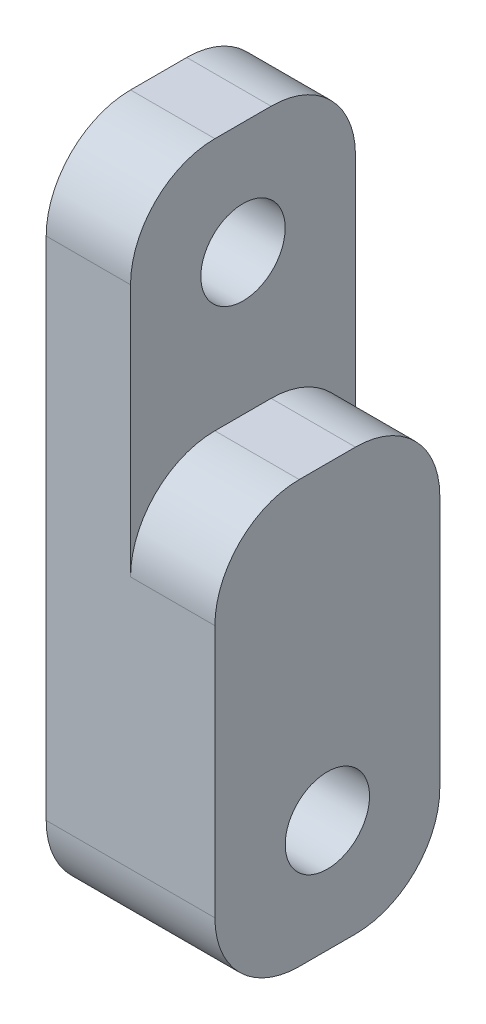
ISO-10303-21;
HEADER;
FILE_DESCRIPTION(('STEP AP214'),'2;1');
FILE_NAME('part.step','',(''),(''),'','','');
FILE_SCHEMA(('AUTOMOTIVE_DESIGN { 1 0 10303 214 1 1 1 1 }'));
ENDSEC;
DATA;
#1=APPLICATION_CONTEXT('core data for automotive mechanical design processes');
#2=APPLICATION_PROTOCOL_DEFINITION('international standard','automotive_design',2000,#1);
#3=PRODUCT_CONTEXT('',#1,'mechanical');
#4=PRODUCT('Part','Part','',(#3));
#5=PRODUCT_RELATED_PRODUCT_CATEGORY('part','',(#4));
#6=PRODUCT_DEFINITION_FORMATION('','',#4);
#7=PRODUCT_DEFINITION_CONTEXT('part definition',#1,'design');
#8=PRODUCT_DEFINITION('design','',#6,#7);
#9=PRODUCT_DEFINITION_SHAPE('','',#8);
#10=(LENGTH_UNIT() NAMED_UNIT(*) SI_UNIT(.MILLI.,.METRE.));
#11=(NAMED_UNIT(*) PLANE_ANGLE_UNIT() SI_UNIT($,.RADIAN.));
#12=(NAMED_UNIT(*) SI_UNIT($,.STERADIAN.) SOLID_ANGLE_UNIT());
#13=UNCERTAINTY_MEASURE_WITH_UNIT(LENGTH_MEASURE(1.E-05),#10,'distance_accuracy_value','');
#14=(GEOMETRIC_REPRESENTATION_CONTEXT(3) GLOBAL_UNCERTAINTY_ASSIGNED_CONTEXT((#13)) GLOBAL_UNIT_ASSIGNED_CONTEXT((#10,
#11,#12)) REPRESENTATION_CONTEXT('',''));
#15=CARTESIAN_POINT('',(0.,0.,0.));
#16=DIRECTION('',(0.,0.,1.));
#17=DIRECTION('',(1.,0.,0.));
#18=AXIS2_PLACEMENT_3D('',#15,#16,#17);
#19=CARTESIAN_POINT('',(30.,60.,20.));
#20=DIRECTION('',(0.,-1.,0.));
#21=DIRECTION('',(0.,0.,-1.));
#22=AXIS2_PLACEMENT_3D('',#19,#20,#21);
#23=PLANE('',#22);
#24=DIRECTION('',(0.,0.,1.));
#25=VECTOR('',#24,1.);
#26=CARTESIAN_POINT('',(15.,60.,0.));
#27=LINE('',#26,#25);
#28=CARTESIAN_POINT('',(15.,60.,-5.));
#29=VERTEX_POINT('',#28);
#30=CARTESIAN_POINT('',(15.,60.,5.));
#31=VERTEX_POINT('',#30);
#32=EDGE_CURVE('E149',#29,#31,#27,.T.);
#33=ORIENTED_EDGE('',*,*,#32,.F.);
#34=DIRECTION('',(-1.,0.,0.));
#35=VECTOR('',#34,1.);
#36=CARTESIAN_POINT('',(30.,60.,-5.));
#37=LINE('',#36,#35);
#38=CARTESIAN_POINT('',(0.,60.,-5.));
#39=VERTEX_POINT('',#38);
#40=EDGE_CURVE('E147',#29,#39,#37,.T.);
#41=ORIENTED_EDGE('',*,*,#40,.T.);
#42=DIRECTION('',(0.,0.,1.));
#43=VECTOR('',#42,1.);
#44=CARTESIAN_POINT('',(0.,60.,20.));
#45=LINE('',#44,#43);
#46=CARTESIAN_POINT('',(0.,60.,5.));
#47=VERTEX_POINT('',#46);
#48=EDGE_CURVE('E168',#39,#47,#45,.T.);
#49=ORIENTED_EDGE('',*,*,#48,.T.);
#50=DIRECTION('',(-1.,0.,0.));
#51=VECTOR('',#50,1.);
#52=CARTESIAN_POINT('',(30.,60.,5.));
#53=LINE('',#52,#51);
#54=EDGE_CURVE('E202',#47,#31,#53,.F.);
#55=ORIENTED_EDGE('',*,*,#54,.T.);
#56=EDGE_LOOP('',(#33,#41,#49,#55));
#57=FACE_BOUND('',#56,.T.);
#58=ADVANCED_FACE('F39',(#57),#23,.F.);
#59=CARTESIAN_POINT('',(30.,40.,0.));
#60=DIRECTION('',(-1.,0.,0.));
#61=DIRECTION('',(0.,0.,1.));
#62=AXIS2_PLACEMENT_3D('',#59,#60,#61);
#63=CYLINDRICAL_SURFACE('',#62,7.5);
#64=CARTESIAN_POINT('',(0.,40.,0.));
#65=DIRECTION('',(1.,0.,0.));
#66=DIRECTION('',(0.,0.,-1.));
#67=AXIS2_PLACEMENT_3D('',#64,#65,#66);
#68=CIRCLE('',#67,7.5);
#69=CARTESIAN_POINT('',(0.,40.,-7.49999999999999));
#70=VERTEX_POINT('',#69);
#71=EDGE_CURVE('E257',#70,#70,#68,.T.);
#72=ORIENTED_EDGE('',*,*,#71,.F.);
#73=EDGE_LOOP('',(#72));
#74=FACE_BOUND('',#73,.T.);
#75=CARTESIAN_POINT('',(15.,40.,0.));
#76=DIRECTION('',(1.,0.,0.));
#77=DIRECTION('',(0.,0.,-1.));
#78=AXIS2_PLACEMENT_3D('',#75,#76,#77);
#79=CIRCLE('',#78,7.5);
#80=CARTESIAN_POINT('',(15.,40.,-7.49999999999999));
#81=VERTEX_POINT('',#80);
#82=EDGE_CURVE('E240',#81,#81,#79,.F.);
#83=ORIENTED_EDGE('',*,*,#82,.F.);
#84=EDGE_LOOP('',(#83));
#85=FACE_BOUND('',#84,.T.);
#86=ADVANCED_FACE('F317',(#74,#85),#63,.F.);
#87=CARTESIAN_POINT('',(30.,45.,-5.));
#88=DIRECTION('',(-1.,0.,0.));
#89=DIRECTION('',(0.,0.,1.));
#90=AXIS2_PLACEMENT_3D('',#87,#88,#89);
#91=CYLINDRICAL_SURFACE('',#90,15.);
#92=ORIENTED_EDGE('',*,*,#40,.F.);
#93=CARTESIAN_POINT('',(15.,45.,-5.));
#94=DIRECTION('',(1.,0.,0.));
#95=DIRECTION('',(0.,0.,-1.));
#96=AXIS2_PLACEMENT_3D('',#93,#94,#95);
#97=CIRCLE('',#96,15.);
#98=CARTESIAN_POINT('',(15.,45.,-20.));
#99=VERTEX_POINT('',#98);
#100=EDGE_CURVE('E131',#99,#29,#97,.T.);
#101=ORIENTED_EDGE('',*,*,#100,.F.);
#102=DIRECTION('',(-1.,0.,0.));
#103=VECTOR('',#102,1.);
#104=CARTESIAN_POINT('',(30.,45.,-20.));
#105=LINE('',#104,#103);
#106=CARTESIAN_POINT('',(0.,45.,-20.));
#107=VERTEX_POINT('',#106);
#108=EDGE_CURVE('E146',#107,#99,#105,.F.);
#109=ORIENTED_EDGE('',*,*,#108,.F.);
#110=CARTESIAN_POINT('',(0.,45.,-5.));
#111=DIRECTION('',(1.,0.,0.));
#112=DIRECTION('',(0.,0.,-1.));
#113=AXIS2_PLACEMENT_3D('',#110,#111,#112);
#114=CIRCLE('',#113,15.);
#115=EDGE_CURVE('E173',#39,#107,#114,.F.);
#116=ORIENTED_EDGE('',*,*,#115,.F.);
#117=EDGE_LOOP('',(#92,#101,#109,#116));
#118=FACE_BOUND('',#117,.T.);
#119=ADVANCED_FACE('F144',(#118),#91,.T.);
#120=CARTESIAN_POINT('',(30.,45.,5.));
#121=DIRECTION('',(-1.,0.,0.));
#122=DIRECTION('',(0.,0.,1.));
#123=AXIS2_PLACEMENT_3D('',#120,#121,#122);
#124=CYLINDRICAL_SURFACE('',#123,15.);
#125=DIRECTION('',(-1.,0.,0.));
#126=VECTOR('',#125,1.);
#127=CARTESIAN_POINT('',(30.,45.,20.));
#128=LINE('',#127,#126);
#129=CARTESIAN_POINT('',(15.,45.,20.));
#130=VERTEX_POINT('',#129);
#131=CARTESIAN_POINT('',(0.,45.,20.));
#132=VERTEX_POINT('',#131);
#133=EDGE_CURVE('E195',#130,#132,#128,.T.);
#134=ORIENTED_EDGE('',*,*,#133,.F.);
#135=CARTESIAN_POINT('',(15.,45.,5.));
#136=DIRECTION('',(1.,0.,0.));
#137=DIRECTION('',(0.,0.,-1.));
#138=AXIS2_PLACEMENT_3D('',#135,#136,#137);
#139=CIRCLE('',#138,15.);
#140=EDGE_CURVE('E246',#31,#130,#139,.T.);
#141=ORIENTED_EDGE('',*,*,#140,.F.);
#142=ORIENTED_EDGE('',*,*,#54,.F.);
#143=CARTESIAN_POINT('',(0.,45.,5.));
#144=DIRECTION('',(1.,0.,0.));
#145=DIRECTION('',(0.,0.,-1.));
#146=AXIS2_PLACEMENT_3D('',#143,#144,#145);
#147=CIRCLE('',#146,15.);
#148=EDGE_CURVE('E162',#132,#47,#147,.F.);
#149=ORIENTED_EDGE('',*,*,#148,.F.);
#150=EDGE_LOOP('',(#134,#141,#142,#149));
#151=FACE_BOUND('',#150,.T.);
#152=ADVANCED_FACE('F286',(#151),#124,.T.);
#153=CARTESIAN_POINT('',(30.,0.,0.));
#154=DIRECTION('',(1.,0.,0.));
#155=DIRECTION('',(0.,0.,-1.));
#156=AXIS2_PLACEMENT_3D('',#153,#154,#155);
#157=PLANE('',#156);
#158=DIRECTION('',(0.,1.,0.));
#159=VECTOR('',#158,1.);
#160=CARTESIAN_POINT('',(30.,60.,-20.));
#161=LINE('',#160,#159);
#162=CARTESIAN_POINT('',(30.,-45.,-20.));
#163=VERTEX_POINT('',#162);
#164=CARTESIAN_POINT('',(30.,0.,-20.));
#165=VERTEX_POINT('',#164);
#166=EDGE_CURVE('E158',#163,#165,#161,.T.);
#167=ORIENTED_EDGE('',*,*,#166,.T.);
#168=CARTESIAN_POINT('',(30.,0.,-5.00000000000001));
#169=DIRECTION('',(1.,0.,0.));
#170=DIRECTION('',(0.,0.,-1.));
#171=AXIS2_PLACEMENT_3D('',#168,#169,#170);
#172=CIRCLE('',#171,15.);
#173=CARTESIAN_POINT('',(30.,15.,-5.00000000000001));
#174=VERTEX_POINT('',#173);
#175=EDGE_CURVE('E214',#165,#174,#172,.T.);
#176=ORIENTED_EDGE('',*,*,#175,.T.);
#177=DIRECTION('',(0.,0.,-1.));
#178=VECTOR('',#177,1.);
#179=CARTESIAN_POINT('',(30.,15.,0.));
#180=LINE('',#179,#178);
#181=CARTESIAN_POINT('',(30.,15.,5.));
#182=VERTEX_POINT('',#181);
#183=EDGE_CURVE('E250',#182,#174,#180,.T.);
#184=ORIENTED_EDGE('',*,*,#183,.F.);
#185=CARTESIAN_POINT('',(30.,0.,5.));
#186=DIRECTION('',(1.,0.,0.));
#187=DIRECTION('',(0.,0.,-1.));
#188=AXIS2_PLACEMENT_3D('',#185,#186,#187);
#189=CIRCLE('',#188,15.);
#190=CARTESIAN_POINT('',(30.,0.,20.));
#191=VERTEX_POINT('',#190);
#192=EDGE_CURVE('E211',#182,#191,#189,.T.);
#193=ORIENTED_EDGE('',*,*,#192,.T.);
#194=DIRECTION('',(0.,-1.,0.));
#195=VECTOR('',#194,1.);
#196=CARTESIAN_POINT('',(30.,60.,20.));
#197=LINE('',#196,#195);
#198=CARTESIAN_POINT('',(30.,-45.,20.));
#199=VERTEX_POINT('',#198);
#200=EDGE_CURVE('E232',#191,#199,#197,.T.);
#201=ORIENTED_EDGE('',*,*,#200,.T.);
#202=CARTESIAN_POINT('',(30.,-45.,5.));
#203=DIRECTION('',(1.,0.,0.));
#204=DIRECTION('',(0.,0.,-1.));
#205=AXIS2_PLACEMENT_3D('',#202,#203,#204);
#206=CIRCLE('',#205,15.);
#207=CARTESIAN_POINT('',(30.,-60.,5.));
#208=VERTEX_POINT('',#207);
#209=EDGE_CURVE('E189',#199,#208,#206,.T.);
#210=ORIENTED_EDGE('',*,*,#209,.T.);
#211=DIRECTION('',(0.,0.,-1.));
#212=VECTOR('',#211,1.);
#213=CARTESIAN_POINT('',(30.,-60.,20.));
#214=LINE('',#213,#212);
#215=CARTESIAN_POINT('',(30.,-60.,-5.00000000000001));
#216=VERTEX_POINT('',#215);
#217=EDGE_CURVE('E165',#208,#216,#214,.T.);
#218=ORIENTED_EDGE('',*,*,#217,.T.);
#219=CARTESIAN_POINT('',(30.,-45.,-5.00000000000001));
#220=DIRECTION('',(1.,0.,0.));
#221=DIRECTION('',(0.,0.,-1.));
#222=AXIS2_PLACEMENT_3D('',#219,#220,#221);
#223=CIRCLE('',#222,15.);
#224=EDGE_CURVE('E192',#216,#163,#223,.T.);
#225=ORIENTED_EDGE('',*,*,#224,.T.);
#226=EDGE_LOOP('',(#167,#176,#184,#193,#201,#210,#218,#225));
#227=FACE_BOUND('',#226,.T.);
#228=CARTESIAN_POINT('',(30.,-40.,0.));
#229=DIRECTION('',(1.,0.,0.));
#230=DIRECTION('',(0.,0.,-1.));
#231=AXIS2_PLACEMENT_3D('',#228,#229,#230);
#232=CIRCLE('',#231,7.5);
#233=CARTESIAN_POINT('',(30.,-40.,-7.5));
#234=VERTEX_POINT('',#233);
#235=EDGE_CURVE('E253',#234,#234,#232,.T.);
#236=ORIENTED_EDGE('',*,*,#235,.F.);
#237=EDGE_LOOP('',(#236));
#238=FACE_BOUND('',#237,.T.);
#239=ADVANCED_FACE('F295',(#227,#238),#157,.T.);
#240=CARTESIAN_POINT('',(0.,0.,0.));
#241=DIRECTION('',(1.,0.,0.));
#242=DIRECTION('',(0.,0.,-1.));
#243=AXIS2_PLACEMENT_3D('',#240,#241,#242);
#244=PLANE('',#243);
#245=DIRECTION('',(0.,1.,0.));
#246=VECTOR('',#245,1.);
#247=CARTESIAN_POINT('',(0.,60.,-20.));
#248=LINE('',#247,#246);
#249=CARTESIAN_POINT('',(0.,-45.,-20.));
#250=VERTEX_POINT('',#249);
#251=EDGE_CURVE('E155',#250,#107,#248,.T.);
#252=ORIENTED_EDGE('',*,*,#251,.F.);
#253=CARTESIAN_POINT('',(0.,-45.,-5.00000000000001));
#254=DIRECTION('',(1.,0.,0.));
#255=DIRECTION('',(0.,0.,-1.));
#256=AXIS2_PLACEMENT_3D('',#253,#254,#255);
#257=CIRCLE('',#256,15.);
#258=CARTESIAN_POINT('',(0.,-60.,-5.00000000000001));
#259=VERTEX_POINT('',#258);
#260=EDGE_CURVE('E179',#250,#259,#257,.F.);
#261=ORIENTED_EDGE('',*,*,#260,.T.);
#262=DIRECTION('',(0.,0.,-1.));
#263=VECTOR('',#262,1.);
#264=CARTESIAN_POINT('',(0.,-60.,20.));
#265=LINE('',#264,#263);
#266=CARTESIAN_POINT('',(0.,-60.,5.));
#267=VERTEX_POINT('',#266);
#268=EDGE_CURVE('E273',#267,#259,#265,.T.);
#269=ORIENTED_EDGE('',*,*,#268,.F.);
#270=CARTESIAN_POINT('',(0.,-45.,5.));
#271=DIRECTION('',(1.,0.,0.));
#272=DIRECTION('',(0.,0.,-1.));
#273=AXIS2_PLACEMENT_3D('',#270,#271,#272);
#274=CIRCLE('',#273,15.);
#275=CARTESIAN_POINT('',(0.,-45.,20.));
#276=VERTEX_POINT('',#275);
#277=EDGE_CURVE('E176',#267,#276,#274,.F.);
#278=ORIENTED_EDGE('',*,*,#277,.T.);
#279=DIRECTION('',(0.,-1.,0.));
#280=VECTOR('',#279,1.);
#281=CARTESIAN_POINT('',(0.,60.,20.));
#282=LINE('',#281,#280);
#283=EDGE_CURVE('E264',#132,#276,#282,.T.);
#284=ORIENTED_EDGE('',*,*,#283,.F.);
#285=ORIENTED_EDGE('',*,*,#148,.T.);
#286=ORIENTED_EDGE('',*,*,#48,.F.);
#287=ORIENTED_EDGE('',*,*,#115,.T.);
#288=EDGE_LOOP('',(#252,#261,#269,#278,#284,#285,#286,#287));
#289=FACE_BOUND('',#288,.T.);
#290=ORIENTED_EDGE('',*,*,#71,.T.);
#291=EDGE_LOOP('',(#290));
#292=FACE_BOUND('',#291,.T.);
#293=CARTESIAN_POINT('',(0.,-40.,0.));
#294=DIRECTION('',(1.,0.,0.));
#295=DIRECTION('',(0.,0.,-1.));
#296=AXIS2_PLACEMENT_3D('',#293,#294,#295);
#297=CIRCLE('',#296,7.5);
#298=CARTESIAN_POINT('',(0.,-40.,-7.5));
#299=VERTEX_POINT('',#298);
#300=EDGE_CURVE('E249',#299,#299,#297,.T.);
#301=ORIENTED_EDGE('',*,*,#300,.T.);
#302=EDGE_LOOP('',(#301));
#303=FACE_BOUND('',#302,.T.);
#304=ADVANCED_FACE('F326',(#289,#292,#303),#244,.F.);
#305=CARTESIAN_POINT('',(30.,60.,20.));
#306=DIRECTION('',(0.,0.,-1.));
#307=DIRECTION('',(-1.,0.,0.));
#308=AXIS2_PLACEMENT_3D('',#305,#306,#307);
#309=PLANE('',#308);
#310=ORIENTED_EDGE('',*,*,#200,.F.);
#311=DIRECTION('',(1.,0.,0.));
#312=VECTOR('',#311,1.);
#313=CARTESIAN_POINT('',(30.,0.,20.));
#314=LINE('',#313,#312);
#315=CARTESIAN_POINT('',(15.,0.,20.));
#316=VERTEX_POINT('',#315);
#317=EDGE_CURVE('E223',#191,#316,#314,.F.);
#318=ORIENTED_EDGE('',*,*,#317,.T.);
#319=DIRECTION('',(0.,-1.,0.));
#320=VECTOR('',#319,1.);
#321=CARTESIAN_POINT('',(15.,0.,20.));
#322=LINE('',#321,#320);
#323=EDGE_CURVE('E54',#130,#316,#322,.T.);
#324=ORIENTED_EDGE('',*,*,#323,.F.);
#325=ORIENTED_EDGE('',*,*,#133,.T.);
#326=ORIENTED_EDGE('',*,*,#283,.T.);
#327=DIRECTION('',(-1.,0.,0.));
#328=VECTOR('',#327,1.);
#329=CARTESIAN_POINT('',(30.,-45.,20.));
#330=LINE('',#329,#328);
#331=EDGE_CURVE('E198',#276,#199,#330,.F.);
#332=ORIENTED_EDGE('',*,*,#331,.T.);
#333=EDGE_LOOP('',(#310,#318,#324,#325,#326,#332));
#334=FACE_BOUND('',#333,.T.);
#335=ADVANCED_FACE('F230',(#334),#309,.F.);
#336=CARTESIAN_POINT('',(30.,-60.,20.));
#337=DIRECTION('',(0.,1.,0.));
#338=DIRECTION('',(0.,0.,1.));
#339=AXIS2_PLACEMENT_3D('',#336,#337,#338);
#340=PLANE('',#339);
#341=ORIENTED_EDGE('',*,*,#268,.T.);
#342=DIRECTION('',(-1.,0.,0.));
#343=VECTOR('',#342,1.);
#344=CARTESIAN_POINT('',(30.,-60.,-5.00000000000001));
#345=LINE('',#344,#343);
#346=EDGE_CURVE('E186',#259,#216,#345,.F.);
#347=ORIENTED_EDGE('',*,*,#346,.T.);
#348=ORIENTED_EDGE('',*,*,#217,.F.);
#349=DIRECTION('',(-1.,0.,0.));
#350=VECTOR('',#349,1.);
#351=CARTESIAN_POINT('',(30.,-60.,5.));
#352=LINE('',#351,#350);
#353=EDGE_CURVE('E182',#208,#267,#352,.T.);
#354=ORIENTED_EDGE('',*,*,#353,.T.);
#355=EDGE_LOOP('',(#341,#347,#348,#354));
#356=FACE_BOUND('',#355,.T.);
#357=ADVANCED_FACE('F299',(#356),#340,.F.);
#358=CARTESIAN_POINT('',(30.,60.,-20.));
#359=DIRECTION('',(0.,0.,1.));
#360=DIRECTION('',(0.,-1.,0.));
#361=AXIS2_PLACEMENT_3D('',#358,#359,#360);
#362=PLANE('',#361);
#363=DIRECTION('',(0.,1.,0.));
#364=VECTOR('',#363,1.);
#365=CARTESIAN_POINT('',(15.,0.,-20.));
#366=LINE('',#365,#364);
#367=CARTESIAN_POINT('',(15.,0.,-20.));
#368=VERTEX_POINT('',#367);
#369=EDGE_CURVE('E128',#368,#99,#366,.T.);
#370=ORIENTED_EDGE('',*,*,#369,.F.);
#371=DIRECTION('',(1.,0.,0.));
#372=VECTOR('',#371,1.);
#373=CARTESIAN_POINT('',(30.,0.,-20.));
#374=LINE('',#373,#372);
#375=EDGE_CURVE('E208',#368,#165,#374,.T.);
#376=ORIENTED_EDGE('',*,*,#375,.T.);
#377=ORIENTED_EDGE('',*,*,#166,.F.);
#378=DIRECTION('',(-1.,0.,0.));
#379=VECTOR('',#378,1.);
#380=CARTESIAN_POINT('',(30.,-45.,-20.));
#381=LINE('',#380,#379);
#382=EDGE_CURVE('E157',#163,#250,#381,.T.);
#383=ORIENTED_EDGE('',*,*,#382,.T.);
#384=ORIENTED_EDGE('',*,*,#251,.T.);
#385=ORIENTED_EDGE('',*,*,#108,.T.);
#386=EDGE_LOOP('',(#370,#376,#377,#383,#384,#385));
#387=FACE_BOUND('',#386,.T.);
#388=ADVANCED_FACE('F152',(#387),#362,.F.);
#389=CARTESIAN_POINT('',(30.,-40.,0.));
#390=DIRECTION('',(-1.,0.,0.));
#391=DIRECTION('',(0.,0.,1.));
#392=AXIS2_PLACEMENT_3D('',#389,#390,#391);
#393=CYLINDRICAL_SURFACE('',#392,7.5);
#394=ORIENTED_EDGE('',*,*,#235,.T.);
#395=EDGE_LOOP('',(#394));
#396=FACE_BOUND('',#395,.T.);
#397=ORIENTED_EDGE('',*,*,#300,.F.);
#398=EDGE_LOOP('',(#397));
#399=FACE_BOUND('',#398,.T.);
#400=ADVANCED_FACE('F330',(#396,#399),#393,.F.);
#401=CARTESIAN_POINT('',(30.,-45.,-5.00000000000001));
#402=DIRECTION('',(-1.,0.,0.));
#403=DIRECTION('',(0.,0.,1.));
#404=AXIS2_PLACEMENT_3D('',#401,#402,#403);
#405=CYLINDRICAL_SURFACE('',#404,15.);
#406=ORIENTED_EDGE('',*,*,#224,.F.);
#407=ORIENTED_EDGE('',*,*,#346,.F.);
#408=ORIENTED_EDGE('',*,*,#260,.F.);
#409=ORIENTED_EDGE('',*,*,#382,.F.);
#410=EDGE_LOOP('',(#406,#407,#408,#409));
#411=FACE_BOUND('',#410,.T.);
#412=ADVANCED_FACE('F303',(#411),#405,.T.);
#413=CARTESIAN_POINT('',(30.,-45.,5.));
#414=DIRECTION('',(-1.,0.,0.));
#415=DIRECTION('',(0.,0.,1.));
#416=AXIS2_PLACEMENT_3D('',#413,#414,#415);
#417=CYLINDRICAL_SURFACE('',#416,15.);
#418=ORIENTED_EDGE('',*,*,#209,.F.);
#419=ORIENTED_EDGE('',*,*,#331,.F.);
#420=ORIENTED_EDGE('',*,*,#277,.F.);
#421=ORIENTED_EDGE('',*,*,#353,.F.);
#422=EDGE_LOOP('',(#418,#419,#420,#421));
#423=FACE_BOUND('',#422,.T.);
#424=ADVANCED_FACE('F291',(#423),#417,.T.);
#425=CARTESIAN_POINT('',(15.,15.,0.));
#426=DIRECTION('',(0.,-1.,0.));
#427=DIRECTION('',(0.,0.,-1.));
#428=AXIS2_PLACEMENT_3D('',#425,#426,#427);
#429=PLANE('',#428);
#430=ORIENTED_EDGE('',*,*,#183,.T.);
#431=DIRECTION('',(1.,0.,0.));
#432=VECTOR('',#431,1.);
#433=CARTESIAN_POINT('',(15.,15.,-5.00000000000001));
#434=LINE('',#433,#432);
#435=CARTESIAN_POINT('',(15.,15.,-5.00000000000001));
#436=VERTEX_POINT('',#435);
#437=EDGE_CURVE('E62',#174,#436,#434,.F.);
#438=ORIENTED_EDGE('',*,*,#437,.T.);
#439=DIRECTION('',(0.,0.,-1.));
#440=VECTOR('',#439,1.);
#441=CARTESIAN_POINT('',(15.,15.,0.));
#442=LINE('',#441,#440);
#443=CARTESIAN_POINT('',(15.,15.,5.));
#444=VERTEX_POINT('',#443);
#445=EDGE_CURVE('E139',#444,#436,#442,.T.);
#446=ORIENTED_EDGE('',*,*,#445,.F.);
#447=DIRECTION('',(1.,0.,0.));
#448=VECTOR('',#447,1.);
#449=CARTESIAN_POINT('',(15.,15.,5.));
#450=LINE('',#449,#448);
#451=EDGE_CURVE('E217',#444,#182,#450,.T.);
#452=ORIENTED_EDGE('',*,*,#451,.T.);
#453=EDGE_LOOP('',(#430,#438,#446,#452));
#454=FACE_BOUND('',#453,.T.);
#455=ADVANCED_FACE('F235',(#454),#429,.F.);
#456=CARTESIAN_POINT('',(15.,0.,0.));
#457=DIRECTION('',(1.,0.,0.));
#458=DIRECTION('',(0.,0.,-1.));
#459=AXIS2_PLACEMENT_3D('',#456,#457,#458);
#460=PLANE('',#459);
#461=ORIENTED_EDGE('',*,*,#82,.T.);
#462=EDGE_LOOP('',(#461));
#463=FACE_BOUND('',#462,.T.);
#464=ORIENTED_EDGE('',*,*,#323,.T.);
#465=CARTESIAN_POINT('',(15.,0.,5.));
#466=DIRECTION('',(1.,0.,0.));
#467=DIRECTION('',(0.,0.,-1.));
#468=AXIS2_PLACEMENT_3D('',#465,#466,#467);
#469=CIRCLE('',#468,15.);
#470=EDGE_CURVE('E11',#316,#444,#469,.F.);
#471=ORIENTED_EDGE('',*,*,#470,.T.);
#472=ORIENTED_EDGE('',*,*,#445,.T.);
#473=CARTESIAN_POINT('',(15.,0.,-5.00000000000001));
#474=DIRECTION('',(1.,0.,0.));
#475=DIRECTION('',(0.,0.,-1.));
#476=AXIS2_PLACEMENT_3D('',#473,#474,#475);
#477=CIRCLE('',#476,15.);
#478=EDGE_CURVE('E48',#436,#368,#477,.F.);
#479=ORIENTED_EDGE('',*,*,#478,.T.);
#480=ORIENTED_EDGE('',*,*,#369,.T.);
#481=ORIENTED_EDGE('',*,*,#100,.T.);
#482=ORIENTED_EDGE('',*,*,#32,.T.);
#483=ORIENTED_EDGE('',*,*,#140,.T.);
#484=EDGE_LOOP('',(#464,#471,#472,#479,#480,#481,#482,#483));
#485=FACE_BOUND('',#484,.T.);
#486=ADVANCED_FACE('F130',(#463,#485),#460,.T.);
#487=CARTESIAN_POINT('',(30.,0.,-5.00000000000001));
#488=DIRECTION('',(1.,0.,0.));
#489=DIRECTION('',(0.,0.,-1.));
#490=AXIS2_PLACEMENT_3D('',#487,#488,#489);
#491=CYLINDRICAL_SURFACE('',#490,15.);
#492=ORIENTED_EDGE('',*,*,#478,.F.);
#493=ORIENTED_EDGE('',*,*,#437,.F.);
#494=ORIENTED_EDGE('',*,*,#175,.F.);
#495=ORIENTED_EDGE('',*,*,#375,.F.);
#496=EDGE_LOOP('',(#492,#493,#494,#495));
#497=FACE_BOUND('',#496,.T.);
#498=ADVANCED_FACE('F307',(#497),#491,.T.);
#499=CARTESIAN_POINT('',(15.,0.,5.));
#500=DIRECTION('',(1.,0.,0.));
#501=DIRECTION('',(0.,0.,-1.));
#502=AXIS2_PLACEMENT_3D('',#499,#500,#501);
#503=CYLINDRICAL_SURFACE('',#502,15.);
#504=ORIENTED_EDGE('',*,*,#470,.F.);
#505=ORIENTED_EDGE('',*,*,#317,.F.);
#506=ORIENTED_EDGE('',*,*,#192,.F.);
#507=ORIENTED_EDGE('',*,*,#451,.F.);
#508=EDGE_LOOP('',(#504,#505,#506,#507));
#509=FACE_BOUND('',#508,.T.);
#510=ADVANCED_FACE('F41',(#509),#503,.T.);
#511=CLOSED_SHELL('',(#58,#86,#119,#152,#239,#304,#335,#357,#388,#400,#412,#424,#455,#486,#498,#510));
#512=MANIFOLD_SOLID_BREP('B2',#511);
#513=ADVANCED_BREP_SHAPE_REPRESENTATION('',(#18,#512),#14);
#514=SHAPE_DEFINITION_REPRESENTATION(#9,#513);
ENDSEC;
END-ISO-10303-21;
